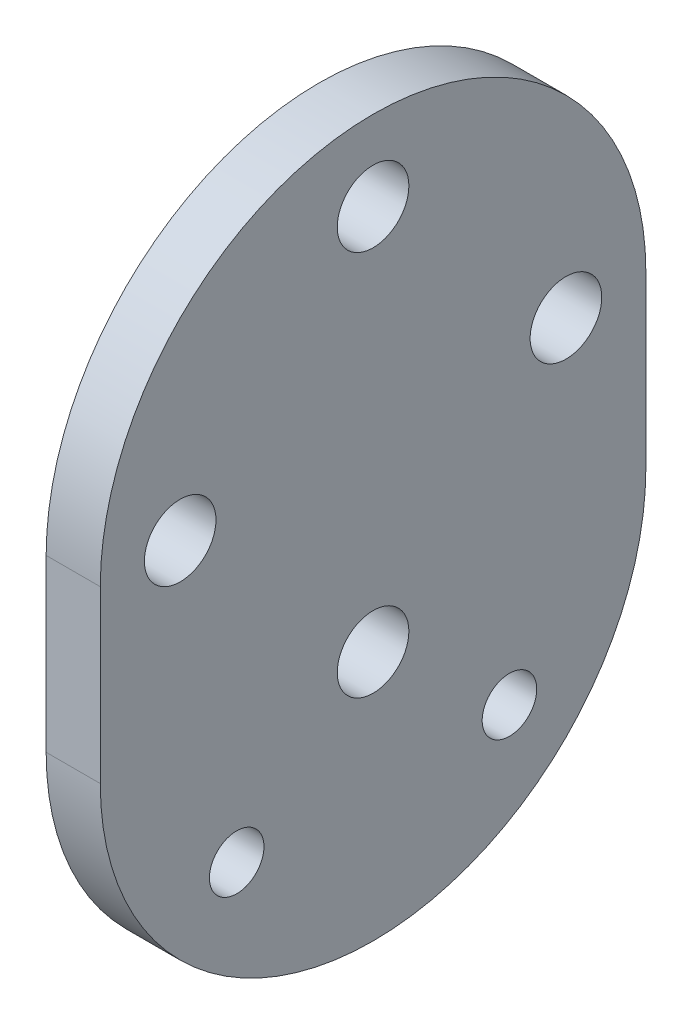
ISO-10303-21;
HEADER;
FILE_DESCRIPTION(('STEP AP214'),'2;1');
FILE_NAME('part.step','',(''),(''),'','','');
FILE_SCHEMA(('AUTOMOTIVE_DESIGN { 1 0 10303 214 1 1 1 1 }'));
ENDSEC;
DATA;
#1=APPLICATION_CONTEXT('core data for automotive mechanical design processes');
#2=APPLICATION_PROTOCOL_DEFINITION('international standard','automotive_design',2000,#1);
#3=PRODUCT_CONTEXT('',#1,'mechanical');
#4=PRODUCT('Part','Part','',(#3));
#5=PRODUCT_RELATED_PRODUCT_CATEGORY('part','',(#4));
#6=PRODUCT_DEFINITION_FORMATION('','',#4);
#7=PRODUCT_DEFINITION_CONTEXT('part definition',#1,'design');
#8=PRODUCT_DEFINITION('design','',#6,#7);
#9=PRODUCT_DEFINITION_SHAPE('','',#8);
#10=(LENGTH_UNIT() NAMED_UNIT(*) SI_UNIT(.MILLI.,.METRE.));
#11=(NAMED_UNIT(*) PLANE_ANGLE_UNIT() SI_UNIT($,.RADIAN.));
#12=(NAMED_UNIT(*) SI_UNIT($,.STERADIAN.) SOLID_ANGLE_UNIT());
#13=UNCERTAINTY_MEASURE_WITH_UNIT(LENGTH_MEASURE(1.E-05),#10,'distance_accuracy_value','');
#14=(GEOMETRIC_REPRESENTATION_CONTEXT(3) GLOBAL_UNCERTAINTY_ASSIGNED_CONTEXT((#13)) GLOBAL_UNIT_ASSIGNED_CONTEXT((#10,
#11,#12)) REPRESENTATION_CONTEXT('',''));
#15=CARTESIAN_POINT('',(0.,0.,0.));
#16=DIRECTION('',(0.,0.,1.));
#17=DIRECTION('',(1.,0.,0.));
#18=AXIS2_PLACEMENT_3D('',#15,#16,#17);
#19=CARTESIAN_POINT('',(3.175,0.,16.));
#20=DIRECTION('',(0.,0.,1.));
#21=DIRECTION('',(0.,-1.,0.));
#22=AXIS2_PLACEMENT_3D('',#19,#20,#21);
#23=PLANE('',#22);
#24=DIRECTION('',(0.,1.,0.));
#25=VECTOR('',#24,1.);
#26=CARTESIAN_POINT('',(0.,0.,16.));
#27=LINE('',#26,#25);
#28=CARTESIAN_POINT('',(0.,-5.,16.));
#29=VERTEX_POINT('',#28);
#30=CARTESIAN_POINT('',(0.,5.,16.));
#31=VERTEX_POINT('',#30);
#32=EDGE_CURVE('E114',#29,#31,#27,.T.);
#33=ORIENTED_EDGE('',*,*,#32,.F.);
#34=DIRECTION('',(-1.,0.,0.));
#35=VECTOR('',#34,1.);
#36=CARTESIAN_POINT('',(3.175,-5.,16.));
#37=LINE('',#36,#35);
#38=CARTESIAN_POINT('',(3.175,-5.,16.));
#39=VERTEX_POINT('',#38);
#40=EDGE_CURVE('E11',#39,#29,#37,.T.);
#41=ORIENTED_EDGE('',*,*,#40,.F.);
#42=DIRECTION('',(0.,1.,0.));
#43=VECTOR('',#42,1.);
#44=CARTESIAN_POINT('',(3.175,0.,16.));
#45=LINE('',#44,#43);
#46=CARTESIAN_POINT('',(3.175,5.,16.));
#47=VERTEX_POINT('',#46);
#48=EDGE_CURVE('E93',#39,#47,#45,.T.);
#49=ORIENTED_EDGE('',*,*,#48,.T.);
#50=DIRECTION('',(-1.,0.,0.));
#51=VECTOR('',#50,1.);
#52=CARTESIAN_POINT('',(3.175,5.,16.));
#53=LINE('',#52,#51);
#54=EDGE_CURVE('E74',#47,#31,#53,.T.);
#55=ORIENTED_EDGE('',*,*,#54,.T.);
#56=EDGE_LOOP('',(#33,#41,#49,#55));
#57=FACE_BOUND('',#56,.T.);
#58=ADVANCED_FACE('F35',(#57),#23,.T.);
#59=CARTESIAN_POINT('',(3.175,-5.,0.));
#60=DIRECTION('',(-1.,0.,0.));
#61=DIRECTION('',(0.,0.,1.));
#62=AXIS2_PLACEMENT_3D('',#59,#60,#61);
#63=CYLINDRICAL_SURFACE('',#62,16.);
#64=CARTESIAN_POINT('',(0.,-5.,0.));
#65=DIRECTION('',(1.,0.,0.));
#66=DIRECTION('',(0.,0.,-1.));
#67=AXIS2_PLACEMENT_3D('',#64,#65,#66);
#68=CIRCLE('',#67,16.);
#69=CARTESIAN_POINT('',(0.,-5.,-16.));
#70=VERTEX_POINT('',#69);
#71=EDGE_CURVE('E98',#29,#70,#68,.T.);
#72=ORIENTED_EDGE('',*,*,#71,.T.);
#73=DIRECTION('',(-1.,0.,0.));
#74=VECTOR('',#73,1.);
#75=CARTESIAN_POINT('',(3.175,-5.,-16.));
#76=LINE('',#75,#74);
#77=CARTESIAN_POINT('',(3.175,-5.,-16.));
#78=VERTEX_POINT('',#77);
#79=EDGE_CURVE('E44',#78,#70,#76,.T.);
#80=ORIENTED_EDGE('',*,*,#79,.F.);
#81=CARTESIAN_POINT('',(3.175,-5.,0.));
#82=DIRECTION('',(1.,0.,0.));
#83=DIRECTION('',(0.,0.,-1.));
#84=AXIS2_PLACEMENT_3D('',#81,#82,#83);
#85=CIRCLE('',#84,16.);
#86=EDGE_CURVE('E89',#39,#78,#85,.T.);
#87=ORIENTED_EDGE('',*,*,#86,.F.);
#88=ORIENTED_EDGE('',*,*,#40,.T.);
#89=EDGE_LOOP('',(#72,#80,#87,#88));
#90=FACE_BOUND('',#89,.T.);
#91=ADVANCED_FACE('F96',(#90),#63,.T.);
#92=CARTESIAN_POINT('',(3.175,0.,-16.));
#93=DIRECTION('',(0.,0.,1.));
#94=DIRECTION('',(0.,-1.,0.));
#95=AXIS2_PLACEMENT_3D('',#92,#93,#94);
#96=PLANE('',#95);
#97=DIRECTION('',(0.,1.,0.));
#98=VECTOR('',#97,1.);
#99=CARTESIAN_POINT('',(0.,0.,-16.));
#100=LINE('',#99,#98);
#101=CARTESIAN_POINT('',(0.,5.,-16.));
#102=VERTEX_POINT('',#101);
#103=EDGE_CURVE('E111',#70,#102,#100,.T.);
#104=ORIENTED_EDGE('',*,*,#103,.T.);
#105=DIRECTION('',(-1.,0.,0.));
#106=VECTOR('',#105,1.);
#107=CARTESIAN_POINT('',(3.175,5.,-16.));
#108=LINE('',#107,#106);
#109=CARTESIAN_POINT('',(3.175,5.,-16.));
#110=VERTEX_POINT('',#109);
#111=EDGE_CURVE('E88',#110,#102,#108,.T.);
#112=ORIENTED_EDGE('',*,*,#111,.F.);
#113=DIRECTION('',(0.,1.,0.));
#114=VECTOR('',#113,1.);
#115=CARTESIAN_POINT('',(3.175,0.,-16.));
#116=LINE('',#115,#114);
#117=EDGE_CURVE('E82',#78,#110,#116,.T.);
#118=ORIENTED_EDGE('',*,*,#117,.F.);
#119=ORIENTED_EDGE('',*,*,#79,.T.);
#120=EDGE_LOOP('',(#104,#112,#118,#119));
#121=FACE_BOUND('',#120,.T.);
#122=ADVANCED_FACE('F85',(#121),#96,.F.);
#123=CARTESIAN_POINT('',(3.175,5.,11.3137084989848));
#124=DIRECTION('',(-1.,0.,0.));
#125=DIRECTION('',(0.,0.,1.));
#126=AXIS2_PLACEMENT_3D('',#123,#124,#125);
#127=CYLINDRICAL_SURFACE('',#126,2.1);
#128=CARTESIAN_POINT('',(3.175,5.,11.3137084989848));
#129=DIRECTION('',(1.,0.,0.));
#130=DIRECTION('',(0.,0.,-1.));
#131=AXIS2_PLACEMENT_3D('',#128,#129,#130);
#132=CIRCLE('',#131,2.1);
#133=CARTESIAN_POINT('',(3.175,5.,9.21370849898476));
#134=VERTEX_POINT('',#133);
#135=EDGE_CURVE('E130',#134,#134,#132,.T.);
#136=ORIENTED_EDGE('',*,*,#135,.T.);
#137=EDGE_LOOP('',(#136));
#138=FACE_BOUND('',#137,.T.);
#139=CARTESIAN_POINT('',(0.,5.,11.3137084989848));
#140=DIRECTION('',(1.,0.,0.));
#141=DIRECTION('',(0.,0.,-1.));
#142=AXIS2_PLACEMENT_3D('',#139,#140,#141);
#143=CIRCLE('',#142,2.1);
#144=CARTESIAN_POINT('',(0.,5.,9.21370849898476));
#145=VERTEX_POINT('',#144);
#146=EDGE_CURVE('E107',#145,#145,#143,.T.);
#147=ORIENTED_EDGE('',*,*,#146,.F.);
#148=EDGE_LOOP('',(#147));
#149=FACE_BOUND('',#148,.T.);
#150=ADVANCED_FACE('F337',(#138,#149),#127,.F.);
#151=CARTESIAN_POINT('',(3.175,5.,0.));
#152=DIRECTION('',(-1.,0.,0.));
#153=DIRECTION('',(0.,0.,1.));
#154=AXIS2_PLACEMENT_3D('',#151,#152,#153);
#155=CYLINDRICAL_SURFACE('',#154,16.);
#156=CARTESIAN_POINT('',(0.,5.,0.));
#157=DIRECTION('',(1.,0.,0.));
#158=DIRECTION('',(0.,0.,-1.));
#159=AXIS2_PLACEMENT_3D('',#156,#157,#158);
#160=CIRCLE('',#159,16.);
#161=EDGE_CURVE('E67',#102,#31,#160,.T.);
#162=ORIENTED_EDGE('',*,*,#161,.T.);
#163=ORIENTED_EDGE('',*,*,#54,.F.);
#164=CARTESIAN_POINT('',(3.175,5.,0.));
#165=DIRECTION('',(1.,0.,0.));
#166=DIRECTION('',(0.,0.,-1.));
#167=AXIS2_PLACEMENT_3D('',#164,#165,#166);
#168=CIRCLE('',#167,16.);
#169=EDGE_CURVE('E52',#110,#47,#168,.T.);
#170=ORIENTED_EDGE('',*,*,#169,.F.);
#171=ORIENTED_EDGE('',*,*,#111,.T.);
#172=EDGE_LOOP('',(#162,#163,#170,#171));
#173=FACE_BOUND('',#172,.T.);
#174=ADVANCED_FACE('F164',(#173),#155,.T.);
#175=CARTESIAN_POINT('',(3.175,5.,-11.3137084989848));
#176=DIRECTION('',(-1.,0.,0.));
#177=DIRECTION('',(0.,0.,1.));
#178=AXIS2_PLACEMENT_3D('',#175,#176,#177);
#179=CYLINDRICAL_SURFACE('',#178,2.1);
#180=CARTESIAN_POINT('',(3.175,5.,-11.3137084989848));
#181=DIRECTION('',(1.,0.,0.));
#182=DIRECTION('',(0.,0.,-1.));
#183=AXIS2_PLACEMENT_3D('',#180,#181,#182);
#184=CIRCLE('',#183,2.1);
#185=CARTESIAN_POINT('',(3.175,5.,-13.4137084989848));
#186=VERTEX_POINT('',#185);
#187=EDGE_CURVE('E135',#186,#186,#184,.T.);
#188=ORIENTED_EDGE('',*,*,#187,.T.);
#189=EDGE_LOOP('',(#188));
#190=FACE_BOUND('',#189,.T.);
#191=CARTESIAN_POINT('',(0.,5.,-11.3137084989848));
#192=DIRECTION('',(1.,0.,0.));
#193=DIRECTION('',(0.,0.,-1.));
#194=AXIS2_PLACEMENT_3D('',#191,#192,#193);
#195=CIRCLE('',#194,2.1);
#196=CARTESIAN_POINT('',(0.,5.,-13.4137084989848));
#197=VERTEX_POINT('',#196);
#198=EDGE_CURVE('E116',#197,#197,#195,.T.);
#199=ORIENTED_EDGE('',*,*,#198,.F.);
#200=EDGE_LOOP('',(#199));
#201=FACE_BOUND('',#200,.T.);
#202=ADVANCED_FACE('F160',(#190,#201),#179,.F.);
#203=CARTESIAN_POINT('',(3.175,-13.,7.99999999999998));
#204=DIRECTION('',(-1.,0.,0.));
#205=DIRECTION('',(0.,0.,1.));
#206=AXIS2_PLACEMENT_3D('',#203,#204,#205);
#207=CYLINDRICAL_SURFACE('',#206,1.6);
#208=CARTESIAN_POINT('',(3.175,-13.,7.99999999999998));
#209=DIRECTION('',(1.,0.,0.));
#210=DIRECTION('',(0.,0.,-1.));
#211=AXIS2_PLACEMENT_3D('',#208,#209,#210);
#212=CIRCLE('',#211,1.6);
#213=CARTESIAN_POINT('',(3.175,-13.,6.39999999999998));
#214=VERTEX_POINT('',#213);
#215=EDGE_CURVE('E138',#214,#214,#212,.T.);
#216=ORIENTED_EDGE('',*,*,#215,.T.);
#217=EDGE_LOOP('',(#216));
#218=FACE_BOUND('',#217,.T.);
#219=CARTESIAN_POINT('',(0.,-13.,7.99999999999998));
#220=DIRECTION('',(1.,0.,0.));
#221=DIRECTION('',(0.,0.,-1.));
#222=AXIS2_PLACEMENT_3D('',#219,#220,#221);
#223=CIRCLE('',#222,1.6);
#224=CARTESIAN_POINT('',(0.,-13.,6.39999999999998));
#225=VERTEX_POINT('',#224);
#226=EDGE_CURVE('E119',#225,#225,#223,.T.);
#227=ORIENTED_EDGE('',*,*,#226,.F.);
#228=EDGE_LOOP('',(#227));
#229=FACE_BOUND('',#228,.T.);
#230=ADVANCED_FACE('F163',(#218,#229),#207,.F.);
#231=CARTESIAN_POINT('',(3.175,-6.31370849898476,0.));
#232=DIRECTION('',(-1.,0.,0.));
#233=DIRECTION('',(0.,0.,1.));
#234=AXIS2_PLACEMENT_3D('',#231,#232,#233);
#235=CYLINDRICAL_SURFACE('',#234,2.1);
#236=CARTESIAN_POINT('',(3.175,-6.31370849898476,0.));
#237=DIRECTION('',(1.,0.,0.));
#238=DIRECTION('',(0.,0.,-1.));
#239=AXIS2_PLACEMENT_3D('',#236,#237,#238);
#240=CIRCLE('',#239,2.1);
#241=CARTESIAN_POINT('',(3.175,-6.31370849898476,-2.1));
#242=VERTEX_POINT('',#241);
#243=EDGE_CURVE('E141',#242,#242,#240,.T.);
#244=ORIENTED_EDGE('',*,*,#243,.T.);
#245=EDGE_LOOP('',(#244));
#246=FACE_BOUND('',#245,.T.);
#247=CARTESIAN_POINT('',(0.,-6.31370849898476,0.));
#248=DIRECTION('',(1.,0.,0.));
#249=DIRECTION('',(0.,0.,-1.));
#250=AXIS2_PLACEMENT_3D('',#247,#248,#249);
#251=CIRCLE('',#250,2.1);
#252=CARTESIAN_POINT('',(0.,-6.31370849898476,-2.1));
#253=VERTEX_POINT('',#252);
#254=EDGE_CURVE('E122',#253,#253,#251,.T.);
#255=ORIENTED_EDGE('',*,*,#254,.F.);
#256=EDGE_LOOP('',(#255));
#257=FACE_BOUND('',#256,.T.);
#258=ADVANCED_FACE('F182',(#246,#257),#235,.F.);
#259=CARTESIAN_POINT('',(3.175,-13.,-8.));
#260=DIRECTION('',(-1.,0.,0.));
#261=DIRECTION('',(0.,0.,1.));
#262=AXIS2_PLACEMENT_3D('',#259,#260,#261);
#263=CYLINDRICAL_SURFACE('',#262,1.6);
#264=CARTESIAN_POINT('',(3.175,-13.,-8.));
#265=DIRECTION('',(1.,0.,0.));
#266=DIRECTION('',(0.,0.,-1.));
#267=AXIS2_PLACEMENT_3D('',#264,#265,#266);
#268=CIRCLE('',#267,1.6);
#269=CARTESIAN_POINT('',(3.175,-13.,-9.6));
#270=VERTEX_POINT('',#269);
#271=EDGE_CURVE('E106',#270,#270,#268,.T.);
#272=ORIENTED_EDGE('',*,*,#271,.T.);
#273=EDGE_LOOP('',(#272));
#274=FACE_BOUND('',#273,.T.);
#275=CARTESIAN_POINT('',(0.,-13.,-8.));
#276=DIRECTION('',(1.,0.,0.));
#277=DIRECTION('',(0.,0.,-1.));
#278=AXIS2_PLACEMENT_3D('',#275,#276,#277);
#279=CIRCLE('',#278,1.6);
#280=CARTESIAN_POINT('',(0.,-13.,-9.6));
#281=VERTEX_POINT('',#280);
#282=EDGE_CURVE('E125',#281,#281,#279,.T.);
#283=ORIENTED_EDGE('',*,*,#282,.F.);
#284=EDGE_LOOP('',(#283));
#285=FACE_BOUND('',#284,.T.);
#286=ADVANCED_FACE('F37',(#274,#285),#263,.F.);
#287=CARTESIAN_POINT('',(3.175,16.3137084989848,0.));
#288=DIRECTION('',(-1.,0.,0.));
#289=DIRECTION('',(0.,0.,1.));
#290=AXIS2_PLACEMENT_3D('',#287,#288,#289);
#291=CYLINDRICAL_SURFACE('',#290,2.1);
#292=CARTESIAN_POINT('',(3.175,16.3137084989848,0.));
#293=DIRECTION('',(1.,0.,0.));
#294=DIRECTION('',(0.,0.,-1.));
#295=AXIS2_PLACEMENT_3D('',#292,#293,#294);
#296=CIRCLE('',#295,2.1);
#297=CARTESIAN_POINT('',(3.175,16.3137084989848,-2.1));
#298=VERTEX_POINT('',#297);
#299=EDGE_CURVE('E102',#298,#298,#296,.T.);
#300=ORIENTED_EDGE('',*,*,#299,.T.);
#301=EDGE_LOOP('',(#300));
#302=FACE_BOUND('',#301,.T.);
#303=CARTESIAN_POINT('',(0.,16.3137084989848,0.));
#304=DIRECTION('',(1.,0.,0.));
#305=DIRECTION('',(0.,0.,-1.));
#306=AXIS2_PLACEMENT_3D('',#303,#304,#305);
#307=CIRCLE('',#306,2.1);
#308=CARTESIAN_POINT('',(0.,16.3137084989848,-2.1));
#309=VERTEX_POINT('',#308);
#310=EDGE_CURVE('E103',#309,#309,#307,.T.);
#311=ORIENTED_EDGE('',*,*,#310,.F.);
#312=EDGE_LOOP('',(#311));
#313=FACE_BOUND('',#312,.T.);
#314=ADVANCED_FACE('F152',(#302,#313),#291,.F.);
#315=CARTESIAN_POINT('',(3.175,0.,0.));
#316=DIRECTION('',(1.,0.,0.));
#317=DIRECTION('',(0.,0.,-1.));
#318=AXIS2_PLACEMENT_3D('',#315,#316,#317);
#319=PLANE('',#318);
#320=ORIENTED_EDGE('',*,*,#271,.F.);
#321=EDGE_LOOP('',(#320));
#322=FACE_BOUND('',#321,.T.);
#323=ORIENTED_EDGE('',*,*,#243,.F.);
#324=EDGE_LOOP('',(#323));
#325=FACE_BOUND('',#324,.T.);
#326=ORIENTED_EDGE('',*,*,#215,.F.);
#327=EDGE_LOOP('',(#326));
#328=FACE_BOUND('',#327,.T.);
#329=ORIENTED_EDGE('',*,*,#187,.F.);
#330=EDGE_LOOP('',(#329));
#331=FACE_BOUND('',#330,.T.);
#332=ORIENTED_EDGE('',*,*,#48,.F.);
#333=ORIENTED_EDGE('',*,*,#86,.T.);
#334=ORIENTED_EDGE('',*,*,#117,.T.);
#335=ORIENTED_EDGE('',*,*,#169,.T.);
#336=EDGE_LOOP('',(#332,#333,#334,#335));
#337=FACE_BOUND('',#336,.T.);
#338=ORIENTED_EDGE('',*,*,#135,.F.);
#339=EDGE_LOOP('',(#338));
#340=FACE_BOUND('',#339,.T.);
#341=ORIENTED_EDGE('',*,*,#299,.F.);
#342=EDGE_LOOP('',(#341));
#343=FACE_BOUND('',#342,.T.);
#344=ADVANCED_FACE('F91',(#322,#325,#328,#331,#337,#340,#343),#319,.T.);
#345=CARTESIAN_POINT('',(0.,0.,0.));
#346=DIRECTION('',(1.,0.,0.));
#347=DIRECTION('',(0.,0.,-1.));
#348=AXIS2_PLACEMENT_3D('',#345,#346,#347);
#349=PLANE('',#348);
#350=ORIENTED_EDGE('',*,*,#282,.T.);
#351=EDGE_LOOP('',(#350));
#352=FACE_BOUND('',#351,.T.);
#353=ORIENTED_EDGE('',*,*,#254,.T.);
#354=EDGE_LOOP('',(#353));
#355=FACE_BOUND('',#354,.T.);
#356=ORIENTED_EDGE('',*,*,#226,.T.);
#357=EDGE_LOOP('',(#356));
#358=FACE_BOUND('',#357,.T.);
#359=ORIENTED_EDGE('',*,*,#198,.T.);
#360=EDGE_LOOP('',(#359));
#361=FACE_BOUND('',#360,.T.);
#362=ORIENTED_EDGE('',*,*,#32,.T.);
#363=ORIENTED_EDGE('',*,*,#161,.F.);
#364=ORIENTED_EDGE('',*,*,#103,.F.);
#365=ORIENTED_EDGE('',*,*,#71,.F.);
#366=EDGE_LOOP('',(#362,#363,#364,#365));
#367=FACE_BOUND('',#366,.T.);
#368=ORIENTED_EDGE('',*,*,#146,.T.);
#369=EDGE_LOOP('',(#368));
#370=FACE_BOUND('',#369,.T.);
#371=ORIENTED_EDGE('',*,*,#310,.T.);
#372=EDGE_LOOP('',(#371));
#373=FACE_BOUND('',#372,.T.);
#374=ADVANCED_FACE('F151',(#352,#355,#358,#361,#367,#370,#373),#349,.F.);
#375=CLOSED_SHELL('',(#58,#91,#122,#150,#174,#202,#230,#258,#286,#314,#344,#374));
#376=MANIFOLD_SOLID_BREP('B2',#375);
#377=ADVANCED_BREP_SHAPE_REPRESENTATION('',(#18,#376),#14);
#378=SHAPE_DEFINITION_REPRESENTATION(#9,#377);
ENDSEC;
END-ISO-10303-21;
